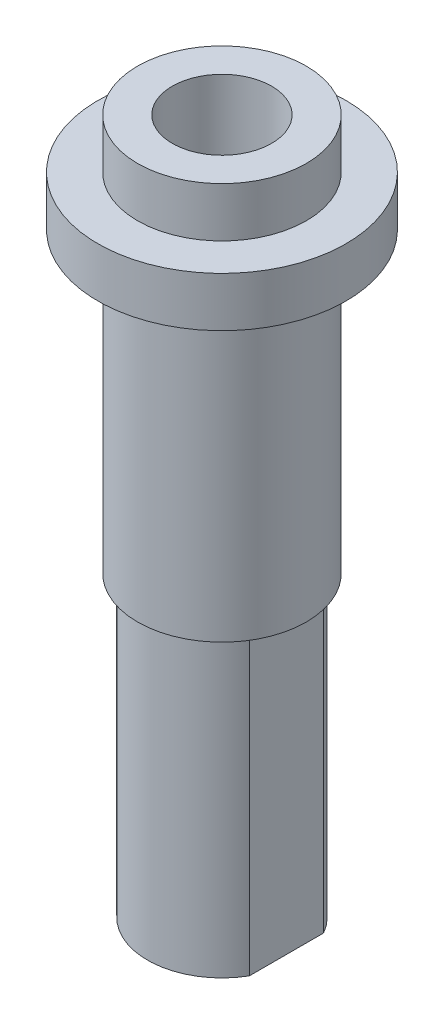
ISO-10303-21;
HEADER;
FILE_DESCRIPTION(('STEP AP214'),'2;1');
FILE_NAME('part.step','',(''),(''),'','','');
FILE_SCHEMA(('AUTOMOTIVE_DESIGN { 1 0 10303 214 1 1 1 1 }'));
ENDSEC;
DATA;
#1=APPLICATION_CONTEXT('core data for automotive mechanical design processes');
#2=APPLICATION_PROTOCOL_DEFINITION('international standard','automotive_design',2000,#1);
#3=PRODUCT_CONTEXT('',#1,'mechanical');
#4=PRODUCT('Part','Part','',(#3));
#5=PRODUCT_RELATED_PRODUCT_CATEGORY('part','',(#4));
#6=PRODUCT_DEFINITION_FORMATION('','',#4);
#7=PRODUCT_DEFINITION_CONTEXT('part definition',#1,'design');
#8=PRODUCT_DEFINITION('design','',#6,#7);
#9=PRODUCT_DEFINITION_SHAPE('','',#8);
#10=(LENGTH_UNIT() NAMED_UNIT(*) SI_UNIT(.MILLI.,.METRE.));
#11=(NAMED_UNIT(*) PLANE_ANGLE_UNIT() SI_UNIT($,.RADIAN.));
#12=(NAMED_UNIT(*) SI_UNIT($,.STERADIAN.) SOLID_ANGLE_UNIT());
#13=UNCERTAINTY_MEASURE_WITH_UNIT(LENGTH_MEASURE(1.E-05),#10,'distance_accuracy_value','');
#14=(GEOMETRIC_REPRESENTATION_CONTEXT(3) GLOBAL_UNCERTAINTY_ASSIGNED_CONTEXT((#13)) GLOBAL_UNIT_ASSIGNED_CONTEXT((#10,
#11,#12)) REPRESENTATION_CONTEXT('',''));
#15=CARTESIAN_POINT('',(0.,0.,0.));
#16=DIRECTION('',(0.,0.,1.));
#17=DIRECTION('',(1.,0.,0.));
#18=AXIS2_PLACEMENT_3D('',#15,#16,#17);
#19=CARTESIAN_POINT('',(5.00000000000001,0.,0.));
#20=DIRECTION('',(0.,-1.,0.));
#21=DIRECTION('',(0.,0.,-1.));
#22=AXIS2_PLACEMENT_3D('',#19,#20,#21);
#23=PLANE('',#22);
#24=CARTESIAN_POINT('',(0.,0.,0.));
#25=DIRECTION('',(0.,-1.,0.));
#26=DIRECTION('',(0.,0.,-1.));
#27=AXIS2_PLACEMENT_3D('',#24,#25,#26);
#28=CIRCLE('',#27,5.00000000000001);
#29=CARTESIAN_POINT('',(0.,0.,-5.00000000000001));
#30=VERTEX_POINT('',#29);
#31=EDGE_CURVE('E48',#30,#30,#28,.T.);
#32=ORIENTED_EDGE('',*,*,#31,.F.);
#33=EDGE_LOOP('',(#32));
#34=FACE_BOUND('',#33,.T.);
#35=DIRECTION('',(0.,0.,1.));
#36=VECTOR('',#35,1.);
#37=CARTESIAN_POINT('',(6.5,0.,3.74165738677394));
#38=LINE('',#37,#36);
#39=CARTESIAN_POINT('',(6.5,0.,-3.74165738677394));
#40=VERTEX_POINT('',#39);
#41=CARTESIAN_POINT('',(6.5,0.,3.74165738677394));
#42=VERTEX_POINT('',#41);
#43=EDGE_CURVE('E74',#40,#42,#38,.T.);
#44=ORIENTED_EDGE('',*,*,#43,.T.);
#45=CARTESIAN_POINT('',(0.,0.,0.));
#46=DIRECTION('',(0.,-1.,0.));
#47=DIRECTION('',(0.,0.,-1.));
#48=AXIS2_PLACEMENT_3D('',#45,#46,#47);
#49=CIRCLE('',#48,7.5);
#50=EDGE_CURVE('E55',#42,#40,#49,.T.);
#51=ORIENTED_EDGE('',*,*,#50,.T.);
#52=EDGE_LOOP('',(#44,#51));
#53=FACE_BOUND('',#52,.T.);
#54=ADVANCED_FACE('F39',(#34,#53),#23,.T.);
#55=CARTESIAN_POINT('',(0.,0.,0.));
#56=DIRECTION('',(0.,-1.,0.));
#57=DIRECTION('',(0.,0.,-1.));
#58=AXIS2_PLACEMENT_3D('',#55,#56,#57);
#59=CYLINDRICAL_SURFACE('',#58,8.5);
#60=CARTESIAN_POINT('',(0.,60.,0.));
#61=DIRECTION('',(0.,-1.,0.));
#62=DIRECTION('',(0.,0.,-1.));
#63=AXIS2_PLACEMENT_3D('',#60,#61,#62);
#64=CIRCLE('',#63,8.5);
#65=CARTESIAN_POINT('',(0.,60.,-8.5));
#66=VERTEX_POINT('',#65);
#67=EDGE_CURVE('E97',#66,#66,#64,.T.);
#68=ORIENTED_EDGE('',*,*,#67,.T.);
#69=EDGE_LOOP('',(#68));
#70=FACE_BOUND('',#69,.T.);
#71=CARTESIAN_POINT('',(0.,30.,0.));
#72=DIRECTION('',(0.,-1.,0.));
#73=DIRECTION('',(0.,0.,-1.));
#74=AXIS2_PLACEMENT_3D('',#71,#72,#73);
#75=CIRCLE('',#74,8.5);
#76=CARTESIAN_POINT('',(0.,30.,-8.5));
#77=VERTEX_POINT('',#76);
#78=EDGE_CURVE('E43',#77,#77,#75,.F.);
#79=ORIENTED_EDGE('',*,*,#78,.T.);
#80=EDGE_LOOP('',(#79));
#81=FACE_BOUND('',#80,.T.);
#82=ADVANCED_FACE('F108',(#70,#81),#59,.T.);
#83=CARTESIAN_POINT('',(8.5,70.,0.));
#84=DIRECTION('',(0.,1.,0.));
#85=DIRECTION('',(0.,0.,1.));
#86=AXIS2_PLACEMENT_3D('',#83,#84,#85);
#87=PLANE('',#86);
#88=CARTESIAN_POINT('',(0.,70.,0.));
#89=DIRECTION('',(0.,-1.,0.));
#90=DIRECTION('',(0.,0.,-1.));
#91=AXIS2_PLACEMENT_3D('',#88,#89,#90);
#92=CIRCLE('',#91,5.);
#93=CARTESIAN_POINT('',(0.,70.,-5.));
#94=VERTEX_POINT('',#93);
#95=EDGE_CURVE('E12',#94,#94,#92,.T.);
#96=ORIENTED_EDGE('',*,*,#95,.T.);
#97=EDGE_LOOP('',(#96));
#98=FACE_BOUND('',#97,.T.);
#99=CARTESIAN_POINT('',(0.,70.,0.));
#100=DIRECTION('',(0.,-1.,0.));
#101=DIRECTION('',(0.,0.,-1.));
#102=AXIS2_PLACEMENT_3D('',#99,#100,#101);
#103=CIRCLE('',#102,8.5);
#104=CARTESIAN_POINT('',(0.,70.,-8.5));
#105=VERTEX_POINT('',#104);
#106=EDGE_CURVE('E85',#105,#105,#103,.T.);
#107=ORIENTED_EDGE('',*,*,#106,.F.);
#108=EDGE_LOOP('',(#107));
#109=FACE_BOUND('',#108,.T.);
#110=ADVANCED_FACE('F41',(#98,#109),#87,.T.);
#111=CARTESIAN_POINT('',(0.,0.,0.));
#112=DIRECTION('',(0.,-1.,0.));
#113=DIRECTION('',(0.,0.,-1.));
#114=AXIS2_PLACEMENT_3D('',#111,#112,#113);
#115=CYLINDRICAL_SURFACE('',#114,5.);
#116=ORIENTED_EDGE('',*,*,#31,.T.);
#117=EDGE_LOOP('',(#116));
#118=FACE_BOUND('',#117,.T.);
#119=ORIENTED_EDGE('',*,*,#95,.F.);
#120=EDGE_LOOP('',(#119));
#121=FACE_BOUND('',#120,.T.);
#122=ADVANCED_FACE('F103',(#118,#121),#115,.F.);
#123=CARTESIAN_POINT('',(8.5,60.,0.));
#124=DIRECTION('',(0.,-1.,0.));
#125=DIRECTION('',(0.,0.,-1.));
#126=AXIS2_PLACEMENT_3D('',#123,#124,#125);
#127=PLANE('',#126);
#128=CARTESIAN_POINT('',(0.,60.,0.));
#129=DIRECTION('',(0.,-1.,0.));
#130=DIRECTION('',(0.,0.,-1.));
#131=AXIS2_PLACEMENT_3D('',#128,#129,#130);
#132=CIRCLE('',#131,12.5);
#133=CARTESIAN_POINT('',(0.,60.,-12.5));
#134=VERTEX_POINT('',#133);
#135=EDGE_CURVE('E94',#134,#134,#132,.T.);
#136=ORIENTED_EDGE('',*,*,#135,.T.);
#137=EDGE_LOOP('',(#136));
#138=FACE_BOUND('',#137,.T.);
#139=ORIENTED_EDGE('',*,*,#67,.F.);
#140=EDGE_LOOP('',(#139));
#141=FACE_BOUND('',#140,.T.);
#142=ADVANCED_FACE('F117',(#138,#141),#127,.T.);
#143=CARTESIAN_POINT('',(0.,0.,0.));
#144=DIRECTION('',(0.,-1.,0.));
#145=DIRECTION('',(0.,0.,-1.));
#146=AXIS2_PLACEMENT_3D('',#143,#144,#145);
#147=CYLINDRICAL_SURFACE('',#146,12.5);
#148=CARTESIAN_POINT('',(0.,65.,0.));
#149=DIRECTION('',(0.,-1.,0.));
#150=DIRECTION('',(0.,0.,-1.));
#151=AXIS2_PLACEMENT_3D('',#148,#149,#150);
#152=CIRCLE('',#151,12.5);
#153=CARTESIAN_POINT('',(0.,65.,-12.5));
#154=VERTEX_POINT('',#153);
#155=EDGE_CURVE('E91',#154,#154,#152,.T.);
#156=ORIENTED_EDGE('',*,*,#155,.T.);
#157=EDGE_LOOP('',(#156));
#158=FACE_BOUND('',#157,.T.);
#159=ORIENTED_EDGE('',*,*,#135,.F.);
#160=EDGE_LOOP('',(#159));
#161=FACE_BOUND('',#160,.T.);
#162=ADVANCED_FACE('F122',(#158,#161),#147,.T.);
#163=CARTESIAN_POINT('',(12.5,65.,0.));
#164=DIRECTION('',(0.,1.,0.));
#165=DIRECTION('',(0.,0.,1.));
#166=AXIS2_PLACEMENT_3D('',#163,#164,#165);
#167=PLANE('',#166);
#168=CARTESIAN_POINT('',(0.,65.,0.));
#169=DIRECTION('',(0.,-1.,0.));
#170=DIRECTION('',(0.,0.,-1.));
#171=AXIS2_PLACEMENT_3D('',#168,#169,#170);
#172=CIRCLE('',#171,8.5);
#173=CARTESIAN_POINT('',(0.,65.,-8.5));
#174=VERTEX_POINT('',#173);
#175=EDGE_CURVE('E88',#174,#174,#172,.T.);
#176=ORIENTED_EDGE('',*,*,#175,.T.);
#177=EDGE_LOOP('',(#176));
#178=FACE_BOUND('',#177,.T.);
#179=ORIENTED_EDGE('',*,*,#155,.F.);
#180=EDGE_LOOP('',(#179));
#181=FACE_BOUND('',#180,.T.);
#182=ADVANCED_FACE('F134',(#178,#181),#167,.T.);
#183=CARTESIAN_POINT('',(0.,0.,0.));
#184=DIRECTION('',(0.,-1.,0.));
#185=DIRECTION('',(0.,0.,-1.));
#186=AXIS2_PLACEMENT_3D('',#183,#184,#185);
#187=CYLINDRICAL_SURFACE('',#186,8.5);
#188=ORIENTED_EDGE('',*,*,#106,.T.);
#189=EDGE_LOOP('',(#188));
#190=FACE_BOUND('',#189,.T.);
#191=ORIENTED_EDGE('',*,*,#175,.F.);
#192=EDGE_LOOP('',(#191));
#193=FACE_BOUND('',#192,.T.);
#194=ADVANCED_FACE('F131',(#190,#193),#187,.T.);
#195=CARTESIAN_POINT('',(0.,30.,0.));
#196=DIRECTION('',(0.,-1.,0.));
#197=DIRECTION('',(0.,0.,-1.));
#198=AXIS2_PLACEMENT_3D('',#195,#196,#197);
#199=PLANE('',#198);
#200=ORIENTED_EDGE('',*,*,#78,.F.);
#201=EDGE_LOOP('',(#200));
#202=FACE_BOUND('',#201,.T.);
#203=DIRECTION('',(0.,0.,1.));
#204=VECTOR('',#203,1.);
#205=CARTESIAN_POINT('',(6.5,30.,3.74165738677394));
#206=LINE('',#205,#204);
#207=CARTESIAN_POINT('',(6.5,30.,-3.74165738677394));
#208=VERTEX_POINT('',#207);
#209=CARTESIAN_POINT('',(6.5,30.,3.74165738677394));
#210=VERTEX_POINT('',#209);
#211=EDGE_CURVE('E72',#208,#210,#206,.T.);
#212=ORIENTED_EDGE('',*,*,#211,.F.);
#213=CARTESIAN_POINT('',(0.,30.,0.));
#214=DIRECTION('',(0.,-1.,0.));
#215=DIRECTION('',(0.,0.,-1.));
#216=AXIS2_PLACEMENT_3D('',#213,#214,#215);
#217=CIRCLE('',#216,7.5);
#218=EDGE_CURVE('E62',#210,#208,#217,.T.);
#219=ORIENTED_EDGE('',*,*,#218,.F.);
#220=EDGE_LOOP('',(#212,#219));
#221=FACE_BOUND('',#220,.T.);
#222=ADVANCED_FACE('F77',(#202,#221),#199,.T.);
#223=CARTESIAN_POINT('',(0.,30.,0.));
#224=DIRECTION('',(0.,-1.,0.));
#225=DIRECTION('',(0.,0.,-1.));
#226=AXIS2_PLACEMENT_3D('',#223,#224,#225);
#227=CYLINDRICAL_SURFACE('',#226,7.5);
#228=ORIENTED_EDGE('',*,*,#50,.F.);
#229=DIRECTION('',(0.,-1.,0.));
#230=VECTOR('',#229,1.);
#231=CARTESIAN_POINT('',(6.5,30.,3.74165738677394));
#232=LINE('',#231,#230);
#233=EDGE_CURVE('E75',#210,#42,#232,.T.);
#234=ORIENTED_EDGE('',*,*,#233,.F.);
#235=ORIENTED_EDGE('',*,*,#218,.T.);
#236=DIRECTION('',(0.,-1.,0.));
#237=VECTOR('',#236,1.);
#238=CARTESIAN_POINT('',(6.5,30.,-3.74165738677394));
#239=LINE('',#238,#237);
#240=EDGE_CURVE('E70',#208,#40,#239,.T.);
#241=ORIENTED_EDGE('',*,*,#240,.T.);
#242=EDGE_LOOP('',(#228,#234,#235,#241));
#243=FACE_BOUND('',#242,.T.);
#244=ADVANCED_FACE('F79',(#243),#227,.T.);
#245=CARTESIAN_POINT('',(6.5,30.,3.74165738677394));
#246=DIRECTION('',(1.,0.,0.));
#247=DIRECTION('',(0.,0.,-1.));
#248=AXIS2_PLACEMENT_3D('',#245,#246,#247);
#249=PLANE('',#248);
#250=ORIENTED_EDGE('',*,*,#43,.F.);
#251=ORIENTED_EDGE('',*,*,#240,.F.);
#252=ORIENTED_EDGE('',*,*,#211,.T.);
#253=ORIENTED_EDGE('',*,*,#233,.T.);
#254=EDGE_LOOP('',(#250,#251,#252,#253));
#255=FACE_BOUND('',#254,.T.);
#256=ADVANCED_FACE('F71',(#255),#249,.T.);
#257=CLOSED_SHELL('',(#54,#82,#110,#122,#142,#162,#182,#194,#222,#244,#256));
#258=MANIFOLD_SOLID_BREP('B2',#257);
#259=ADVANCED_BREP_SHAPE_REPRESENTATION('',(#18,#258),#14);
#260=SHAPE_DEFINITION_REPRESENTATION(#9,#259);
ENDSEC;
END-ISO-10303-21;
